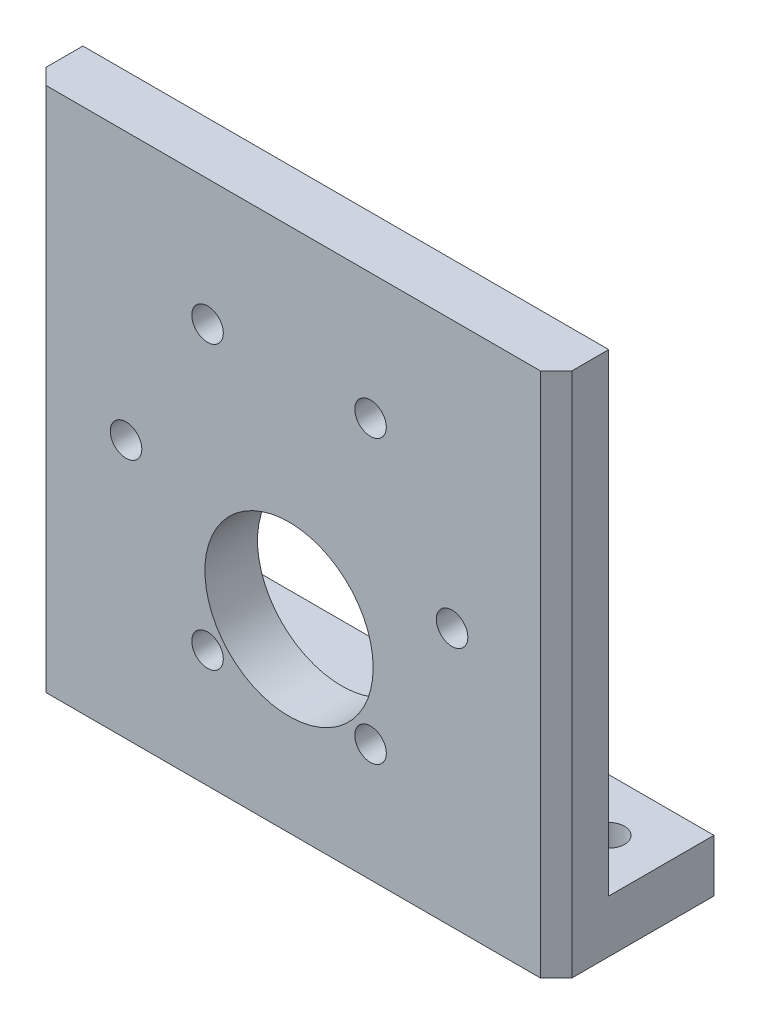
ISO-10303-21;
HEADER;
FILE_DESCRIPTION(('STEP AP214'),'2;1');
FILE_NAME('part.step','',(''),(''),'','','');
FILE_SCHEMA(('AUTOMOTIVE_DESIGN { 1 0 10303 214 1 1 1 1 }'));
ENDSEC;
DATA;
#1=APPLICATION_CONTEXT('core data for automotive mechanical design processes');
#2=APPLICATION_PROTOCOL_DEFINITION('international standard','automotive_design',2000,#1);
#3=PRODUCT_CONTEXT('',#1,'mechanical');
#4=PRODUCT('Part','Part','',(#3));
#5=PRODUCT_RELATED_PRODUCT_CATEGORY('part','',(#4));
#6=PRODUCT_DEFINITION_FORMATION('','',#4);
#7=PRODUCT_DEFINITION_CONTEXT('part definition',#1,'design');
#8=PRODUCT_DEFINITION('design','',#6,#7);
#9=PRODUCT_DEFINITION_SHAPE('','',#8);
#10=(LENGTH_UNIT() NAMED_UNIT(*) SI_UNIT(.MILLI.,.METRE.));
#11=(NAMED_UNIT(*) PLANE_ANGLE_UNIT() SI_UNIT($,.RADIAN.));
#12=(NAMED_UNIT(*) SI_UNIT($,.STERADIAN.) SOLID_ANGLE_UNIT());
#13=UNCERTAINTY_MEASURE_WITH_UNIT(LENGTH_MEASURE(1.E-05),#10,'distance_accuracy_value','');
#14=(GEOMETRIC_REPRESENTATION_CONTEXT(3) GLOBAL_UNCERTAINTY_ASSIGNED_CONTEXT((#13)) GLOBAL_UNIT_ASSIGNED_CONTEXT((#10,
#11,#12)) REPRESENTATION_CONTEXT('',''));
#15=CARTESIAN_POINT('',(0.,0.,0.));
#16=DIRECTION('',(0.,0.,1.));
#17=DIRECTION('',(1.,0.,0.));
#18=AXIS2_PLACEMENT_3D('',#15,#16,#17);
#19=CARTESIAN_POINT('',(0.,0.,5.));
#20=DIRECTION('',(0.,0.,-1.));
#21=DIRECTION('',(-1.,0.,0.));
#22=AXIS2_PLACEMENT_3D('',#19,#20,#21);
#23=PLANE('',#22);
#24=DIRECTION('',(1.,0.,0.));
#25=VECTOR('',#24,1.);
#26=CARTESIAN_POINT('',(-24.3882668097816,-24.2880457452489,5.));
#27=LINE('',#26,#25);
#28=CARTESIAN_POINT('',(-22.8882668097816,-24.2880457452489,5.));
#29=VERTEX_POINT('',#28);
#30=CARTESIAN_POINT('',(24.1117331902184,-24.2880457452489,5.));
#31=VERTEX_POINT('',#30);
#32=EDGE_CURVE('E119',#29,#31,#27,.T.);
#33=ORIENTED_EDGE('',*,*,#32,.T.);
#34=DIRECTION('',(0.,1.,0.));
#35=VECTOR('',#34,1.);
#36=CARTESIAN_POINT('',(24.1117331902184,0.,5.));
#37=LINE('',#36,#35);
#38=CARTESIAN_POINT('',(24.1117331902184,25.7119542547511,5.));
#39=VERTEX_POINT('',#38);
#40=EDGE_CURVE('E250',#31,#39,#37,.T.);
#41=ORIENTED_EDGE('',*,*,#40,.T.);
#42=DIRECTION('',(-1.,0.,0.));
#43=VECTOR('',#42,1.);
#44=CARTESIAN_POINT('',(-24.3882668097816,25.7119542547511,5.));
#45=LINE('',#44,#43);
#46=CARTESIAN_POINT('',(-22.8882668097816,25.7119542547511,5.));
#47=VERTEX_POINT('',#46);
#48=EDGE_CURVE('E212',#39,#47,#45,.T.);
#49=ORIENTED_EDGE('',*,*,#48,.T.);
#50=DIRECTION('',(0.,-1.,0.));
#51=VECTOR('',#50,1.);
#52=CARTESIAN_POINT('',(-22.8882668097816,0.,5.));
#53=LINE('',#52,#51);
#54=EDGE_CURVE('E238',#47,#29,#53,.T.);
#55=ORIENTED_EDGE('',*,*,#54,.T.);
#56=EDGE_LOOP('',(#33,#41,#49,#55));
#57=FACE_BOUND('',#56,.T.);
#58=CARTESIAN_POINT('',(-7.53826680978156,13.7353480134099,5.));
#59=DIRECTION('',(0.,0.,1.));
#60=DIRECTION('',(1.,0.,0.));
#61=AXIS2_PLACEMENT_3D('',#58,#59,#60);
#62=CIRCLE('',#61,1.5);
#63=CARTESIAN_POINT('',(-6.03826680978157,13.7353480134099,5.));
#64=VERTEX_POINT('',#63);
#65=EDGE_CURVE('E204',#64,#64,#62,.T.);
#66=ORIENTED_EDGE('',*,*,#65,.F.);
#67=EDGE_LOOP('',(#66));
#68=FACE_BOUND('',#67,.T.);
#69=CARTESIAN_POINT('',(7.96173319021844,13.7353480134099,5.));
#70=DIRECTION('',(0.,0.,1.));
#71=DIRECTION('',(1.,0.,0.));
#72=AXIS2_PLACEMENT_3D('',#69,#70,#71);
#73=CIRCLE('',#72,1.5);
#74=CARTESIAN_POINT('',(9.46173319021844,13.7353480134099,5.));
#75=VERTEX_POINT('',#74);
#76=EDGE_CURVE('E196',#75,#75,#73,.T.);
#77=ORIENTED_EDGE('',*,*,#76,.F.);
#78=EDGE_LOOP('',(#77));
#79=FACE_BOUND('',#78,.T.);
#80=CARTESIAN_POINT('',(-15.2882668097816,0.311954254751074,5.));
#81=DIRECTION('',(0.,0.,1.));
#82=DIRECTION('',(1.,0.,0.));
#83=AXIS2_PLACEMENT_3D('',#80,#81,#82);
#84=CIRCLE('',#83,1.5);
#85=CARTESIAN_POINT('',(-13.7882668097816,0.311954254751074,5.));
#86=VERTEX_POINT('',#85);
#87=EDGE_CURVE('E188',#86,#86,#84,.T.);
#88=ORIENTED_EDGE('',*,*,#87,.F.);
#89=EDGE_LOOP('',(#88));
#90=FACE_BOUND('',#89,.T.);
#91=CARTESIAN_POINT('',(-7.53826680978156,-13.1114395039077,5.));
#92=DIRECTION('',(0.,0.,1.));
#93=DIRECTION('',(1.,0.,0.));
#94=AXIS2_PLACEMENT_3D('',#91,#92,#93);
#95=CIRCLE('',#94,1.5);
#96=CARTESIAN_POINT('',(-6.03826680978156,-13.1114395039077,5.));
#97=VERTEX_POINT('',#96);
#98=EDGE_CURVE('E180',#97,#97,#95,.T.);
#99=ORIENTED_EDGE('',*,*,#98,.F.);
#100=EDGE_LOOP('',(#99));
#101=FACE_BOUND('',#100,.T.);
#102=CARTESIAN_POINT('',(7.96173319021844,-13.1114395039077,5.));
#103=DIRECTION('',(0.,0.,1.));
#104=DIRECTION('',(1.,0.,0.));
#105=AXIS2_PLACEMENT_3D('',#102,#103,#104);
#106=CIRCLE('',#105,1.5);
#107=CARTESIAN_POINT('',(9.46173319021844,-13.1114395039077,5.));
#108=VERTEX_POINT('',#107);
#109=EDGE_CURVE('E172',#108,#108,#106,.T.);
#110=ORIENTED_EDGE('',*,*,#109,.F.);
#111=EDGE_LOOP('',(#110));
#112=FACE_BOUND('',#111,.T.);
#113=CARTESIAN_POINT('',(15.7117331902184,0.311954254751071,5.));
#114=DIRECTION('',(0.,0.,1.));
#115=DIRECTION('',(1.,0.,0.));
#116=AXIS2_PLACEMENT_3D('',#113,#114,#115);
#117=CIRCLE('',#116,1.5);
#118=CARTESIAN_POINT('',(17.2117331902184,0.311954254751071,5.));
#119=VERTEX_POINT('',#118);
#120=EDGE_CURVE('E164',#119,#119,#117,.T.);
#121=ORIENTED_EDGE('',*,*,#120,.F.);
#122=EDGE_LOOP('',(#121));
#123=FACE_BOUND('',#122,.T.);
#124=CARTESIAN_POINT('',(0.211733190218437,-6.68804574524893,5.));
#125=DIRECTION('',(0.,0.,1.));
#126=DIRECTION('',(1.,0.,0.));
#127=AXIS2_PLACEMENT_3D('',#124,#125,#126);
#128=CIRCLE('',#127,8.00000000000001);
#129=CARTESIAN_POINT('',(8.21173319021844,-6.68804574524893,5.));
#130=VERTEX_POINT('',#129);
#131=EDGE_CURVE('E156',#130,#130,#128,.T.);
#132=ORIENTED_EDGE('',*,*,#131,.F.);
#133=EDGE_LOOP('',(#132));
#134=FACE_BOUND('',#133,.T.);
#135=ADVANCED_FACE('F45',(#57,#68,#79,#90,#101,#112,#123,#134),#23,.F.);
#136=CARTESIAN_POINT('',(0.,0.,0.));
#137=DIRECTION('',(0.,0.,-1.));
#138=DIRECTION('',(-1.,0.,0.));
#139=AXIS2_PLACEMENT_3D('',#136,#137,#138);
#140=PLANE('',#139);
#141=DIRECTION('',(1.,0.,0.));
#142=VECTOR('',#141,1.);
#143=CARTESIAN_POINT('',(25.6117331902184,-19.2880457452489,0.));
#144=LINE('',#143,#142);
#145=CARTESIAN_POINT('',(-24.3882668097816,-19.2880457452489,0.));
#146=VERTEX_POINT('',#145);
#147=CARTESIAN_POINT('',(25.6117331902184,-19.2880457452489,0.));
#148=VERTEX_POINT('',#147);
#149=EDGE_CURVE('E134',#146,#148,#144,.T.);
#150=ORIENTED_EDGE('',*,*,#149,.F.);
#151=DIRECTION('',(0.,-1.,0.));
#152=VECTOR('',#151,1.);
#153=CARTESIAN_POINT('',(-24.3882668097816,-24.2880457452489,0.));
#154=LINE('',#153,#152);
#155=CARTESIAN_POINT('',(-24.3882668097816,25.7119542547511,0.));
#156=VERTEX_POINT('',#155);
#157=EDGE_CURVE('E216',#156,#146,#154,.T.);
#158=ORIENTED_EDGE('',*,*,#157,.F.);
#159=DIRECTION('',(-1.,0.,0.));
#160=VECTOR('',#159,1.);
#161=CARTESIAN_POINT('',(-24.3882668097816,25.7119542547511,0.));
#162=LINE('',#161,#160);
#163=CARTESIAN_POINT('',(25.6117331902184,25.7119542547511,0.));
#164=VERTEX_POINT('',#163);
#165=EDGE_CURVE('E223',#164,#156,#162,.T.);
#166=ORIENTED_EDGE('',*,*,#165,.F.);
#167=DIRECTION('',(0.,1.,0.));
#168=VECTOR('',#167,1.);
#169=CARTESIAN_POINT('',(25.6117331902184,-24.2880457452489,0.));
#170=LINE('',#169,#168);
#171=EDGE_CURVE('E208',#148,#164,#170,.T.);
#172=ORIENTED_EDGE('',*,*,#171,.F.);
#173=EDGE_LOOP('',(#150,#158,#166,#172));
#174=FACE_BOUND('',#173,.T.);
#175=CARTESIAN_POINT('',(15.7117331902184,0.311954254751071,0.));
#176=DIRECTION('',(0.,0.,1.));
#177=DIRECTION('',(1.,0.,0.));
#178=AXIS2_PLACEMENT_3D('',#175,#176,#177);
#179=CIRCLE('',#178,1.5);
#180=CARTESIAN_POINT('',(17.2117331902184,0.311954254751071,0.));
#181=VERTEX_POINT('',#180);
#182=EDGE_CURVE('E160',#181,#181,#179,.T.);
#183=ORIENTED_EDGE('',*,*,#182,.T.);
#184=EDGE_LOOP('',(#183));
#185=FACE_BOUND('',#184,.T.);
#186=CARTESIAN_POINT('',(-7.53826680978156,-13.1114395039077,0.));
#187=DIRECTION('',(0.,0.,1.));
#188=DIRECTION('',(1.,0.,0.));
#189=AXIS2_PLACEMENT_3D('',#186,#187,#188);
#190=CIRCLE('',#189,1.5);
#191=CARTESIAN_POINT('',(-6.03826680978156,-13.1114395039077,0.));
#192=VERTEX_POINT('',#191);
#193=EDGE_CURVE('E176',#192,#192,#190,.T.);
#194=ORIENTED_EDGE('',*,*,#193,.T.);
#195=EDGE_LOOP('',(#194));
#196=FACE_BOUND('',#195,.T.);
#197=CARTESIAN_POINT('',(7.96173319021844,13.7353480134099,0.));
#198=DIRECTION('',(0.,0.,1.));
#199=DIRECTION('',(1.,0.,0.));
#200=AXIS2_PLACEMENT_3D('',#197,#198,#199);
#201=CIRCLE('',#200,1.5);
#202=CARTESIAN_POINT('',(9.46173319021844,13.7353480134099,0.));
#203=VERTEX_POINT('',#202);
#204=EDGE_CURVE('E192',#203,#203,#201,.T.);
#205=ORIENTED_EDGE('',*,*,#204,.T.);
#206=EDGE_LOOP('',(#205));
#207=FACE_BOUND('',#206,.T.);
#208=CARTESIAN_POINT('',(-7.53826680978156,13.7353480134099,0.));
#209=DIRECTION('',(0.,0.,1.));
#210=DIRECTION('',(1.,0.,0.));
#211=AXIS2_PLACEMENT_3D('',#208,#209,#210);
#212=CIRCLE('',#211,1.5);
#213=CARTESIAN_POINT('',(-6.03826680978157,13.7353480134099,0.));
#214=VERTEX_POINT('',#213);
#215=EDGE_CURVE('E200',#214,#214,#212,.T.);
#216=ORIENTED_EDGE('',*,*,#215,.T.);
#217=EDGE_LOOP('',(#216));
#218=FACE_BOUND('',#217,.T.);
#219=CARTESIAN_POINT('',(-15.2882668097816,0.311954254751074,0.));
#220=DIRECTION('',(0.,0.,1.));
#221=DIRECTION('',(1.,0.,0.));
#222=AXIS2_PLACEMENT_3D('',#219,#220,#221);
#223=CIRCLE('',#222,1.5);
#224=CARTESIAN_POINT('',(-13.7882668097816,0.311954254751074,0.));
#225=VERTEX_POINT('',#224);
#226=EDGE_CURVE('E184',#225,#225,#223,.T.);
#227=ORIENTED_EDGE('',*,*,#226,.T.);
#228=EDGE_LOOP('',(#227));
#229=FACE_BOUND('',#228,.T.);
#230=CARTESIAN_POINT('',(7.96173319021844,-13.1114395039077,0.));
#231=DIRECTION('',(0.,0.,1.));
#232=DIRECTION('',(1.,0.,0.));
#233=AXIS2_PLACEMENT_3D('',#230,#231,#232);
#234=CIRCLE('',#233,1.5);
#235=CARTESIAN_POINT('',(9.46173319021844,-13.1114395039077,0.));
#236=VERTEX_POINT('',#235);
#237=EDGE_CURVE('E168',#236,#236,#234,.T.);
#238=ORIENTED_EDGE('',*,*,#237,.T.);
#239=EDGE_LOOP('',(#238));
#240=FACE_BOUND('',#239,.T.);
#241=CARTESIAN_POINT('',(0.211733190218437,-6.68804574524893,0.));
#242=DIRECTION('',(0.,0.,1.));
#243=DIRECTION('',(1.,0.,0.));
#244=AXIS2_PLACEMENT_3D('',#241,#242,#243);
#245=CIRCLE('',#244,8.00000000000001);
#246=CARTESIAN_POINT('',(8.21173319021844,-6.68804574524893,0.));
#247=VERTEX_POINT('',#246);
#248=EDGE_CURVE('E155',#247,#247,#245,.T.);
#249=ORIENTED_EDGE('',*,*,#248,.T.);
#250=EDGE_LOOP('',(#249));
#251=FACE_BOUND('',#250,.T.);
#252=ADVANCED_FACE('F276',(#174,#185,#196,#207,#218,#229,#240,#251),#140,.T.);
#253=CARTESIAN_POINT('',(25.6117331902184,-24.2880457452489,5.));
#254=DIRECTION('',(-1.,0.,0.));
#255=DIRECTION('',(0.,0.,1.));
#256=AXIS2_PLACEMENT_3D('',#253,#254,#255);
#257=PLANE('',#256);
#258=DIRECTION('',(0.,0.,-1.));
#259=VECTOR('',#258,1.);
#260=CARTESIAN_POINT('',(25.6117331902184,25.7119542547511,5.));
#261=LINE('',#260,#259);
#262=CARTESIAN_POINT('',(25.6117331902184,25.7119542547511,3.50000000000001));
#263=VERTEX_POINT('',#262);
#264=EDGE_CURVE('E235',#263,#164,#261,.T.);
#265=ORIENTED_EDGE('',*,*,#264,.F.);
#266=DIRECTION('',(0.,-1.,0.));
#267=VECTOR('',#266,1.);
#268=CARTESIAN_POINT('',(25.6117331902184,-24.2880457452489,3.50000000000001));
#269=LINE('',#268,#267);
#270=CARTESIAN_POINT('',(25.6117331902184,-24.2880457452489,3.50000000000001));
#271=VERTEX_POINT('',#270);
#272=EDGE_CURVE('E70',#263,#271,#269,.T.);
#273=ORIENTED_EDGE('',*,*,#272,.T.);
#274=DIRECTION('',(0.,0.,-1.));
#275=VECTOR('',#274,1.);
#276=CARTESIAN_POINT('',(25.6117331902184,-24.2880457452489,5.));
#277=LINE('',#276,#275);
#278=CARTESIAN_POINT('',(25.6117331902184,-24.2880457452489,-10.));
#279=VERTEX_POINT('',#278);
#280=EDGE_CURVE('E110',#271,#279,#277,.T.);
#281=ORIENTED_EDGE('',*,*,#280,.T.);
#282=DIRECTION('',(0.,-1.,0.));
#283=VECTOR('',#282,1.);
#284=CARTESIAN_POINT('',(25.6117331902184,-24.2880457452489,-10.));
#285=LINE('',#284,#283);
#286=CARTESIAN_POINT('',(25.6117331902184,-19.2880457452489,-10.));
#287=VERTEX_POINT('',#286);
#288=EDGE_CURVE('E115',#287,#279,#285,.T.);
#289=ORIENTED_EDGE('',*,*,#288,.F.);
#290=DIRECTION('',(0.,0.,1.));
#291=VECTOR('',#290,1.);
#292=CARTESIAN_POINT('',(25.6117331902184,-19.2880457452489,-10.));
#293=LINE('',#292,#291);
#294=EDGE_CURVE('E147',#287,#148,#293,.T.);
#295=ORIENTED_EDGE('',*,*,#294,.T.);
#296=ORIENTED_EDGE('',*,*,#171,.T.);
#297=EDGE_LOOP('',(#265,#273,#281,#289,#295,#296));
#298=FACE_BOUND('',#297,.T.);
#299=ADVANCED_FACE('F112',(#298),#257,.F.);
#300=CARTESIAN_POINT('',(-24.3882668097816,25.7119542547511,5.));
#301=DIRECTION('',(0.,-1.,0.));
#302=DIRECTION('',(0.,0.,-1.));
#303=AXIS2_PLACEMENT_3D('',#300,#301,#302);
#304=PLANE('',#303);
#305=ORIENTED_EDGE('',*,*,#48,.F.);
#306=DIRECTION('',(-0.707106781186546,0.,0.707106781186549));
#307=VECTOR('',#306,1.);
#308=CARTESIAN_POINT('',(24.1117331902184,25.7119542547511,5.));
#309=LINE('',#308,#307);
#310=EDGE_CURVE('E257',#39,#263,#309,.F.);
#311=ORIENTED_EDGE('',*,*,#310,.T.);
#312=ORIENTED_EDGE('',*,*,#264,.T.);
#313=ORIENTED_EDGE('',*,*,#165,.T.);
#314=DIRECTION('',(0.,0.,-1.));
#315=VECTOR('',#314,1.);
#316=CARTESIAN_POINT('',(-24.3882668097816,25.7119542547511,5.));
#317=LINE('',#316,#315);
#318=CARTESIAN_POINT('',(-24.3882668097816,25.7119542547511,3.50000000000001));
#319=VERTEX_POINT('',#318);
#320=EDGE_CURVE('E232',#319,#156,#317,.T.);
#321=ORIENTED_EDGE('',*,*,#320,.F.);
#322=DIRECTION('',(-0.707106781186546,0.,-0.707106781186549));
#323=VECTOR('',#322,1.);
#324=CARTESIAN_POINT('',(-22.8882668097816,25.7119542547511,5.));
#325=LINE('',#324,#323);
#326=EDGE_CURVE('E254',#319,#47,#325,.F.);
#327=ORIENTED_EDGE('',*,*,#326,.T.);
#328=EDGE_LOOP('',(#305,#311,#312,#313,#321,#327));
#329=FACE_BOUND('',#328,.T.);
#330=ADVANCED_FACE('F272',(#329),#304,.F.);
#331=CARTESIAN_POINT('',(-24.3882668097816,-24.2880457452489,5.));
#332=DIRECTION('',(1.,0.,0.));
#333=DIRECTION('',(0.,0.,-1.));
#334=AXIS2_PLACEMENT_3D('',#331,#332,#333);
#335=PLANE('',#334);
#336=DIRECTION('',(0.,0.,-1.));
#337=VECTOR('',#336,1.);
#338=CARTESIAN_POINT('',(-24.3882668097816,-24.2880457452489,5.));
#339=LINE('',#338,#337);
#340=CARTESIAN_POINT('',(-24.3882668097816,-24.2880457452489,3.50000000000001));
#341=VERTEX_POINT('',#340);
#342=CARTESIAN_POINT('',(-24.3882668097816,-24.2880457452489,-10.));
#343=VERTEX_POINT('',#342);
#344=EDGE_CURVE('E118',#341,#343,#339,.T.);
#345=ORIENTED_EDGE('',*,*,#344,.F.);
#346=DIRECTION('',(0.,1.,0.));
#347=VECTOR('',#346,1.);
#348=CARTESIAN_POINT('',(-24.3882668097816,-24.2880457452489,3.50000000000001));
#349=LINE('',#348,#347);
#350=EDGE_CURVE('E11',#341,#319,#349,.T.);
#351=ORIENTED_EDGE('',*,*,#350,.T.);
#352=ORIENTED_EDGE('',*,*,#320,.T.);
#353=ORIENTED_EDGE('',*,*,#157,.T.);
#354=DIRECTION('',(0.,0.,1.));
#355=VECTOR('',#354,1.);
#356=CARTESIAN_POINT('',(-24.3882668097816,-19.2880457452489,-10.));
#357=LINE('',#356,#355);
#358=CARTESIAN_POINT('',(-24.3882668097816,-19.2880457452489,-10.));
#359=VERTEX_POINT('',#358);
#360=EDGE_CURVE('E151',#359,#146,#357,.T.);
#361=ORIENTED_EDGE('',*,*,#360,.F.);
#362=DIRECTION('',(0.,1.,0.));
#363=VECTOR('',#362,1.);
#364=CARTESIAN_POINT('',(-24.3882668097816,-24.2880457452489,-10.));
#365=LINE('',#364,#363);
#366=EDGE_CURVE('E127',#343,#359,#365,.T.);
#367=ORIENTED_EDGE('',*,*,#366,.F.);
#368=EDGE_LOOP('',(#345,#351,#352,#353,#361,#367));
#369=FACE_BOUND('',#368,.T.);
#370=ADVANCED_FACE('F283',(#369),#335,.F.);
#371=CARTESIAN_POINT('',(-24.3882668097816,-24.2880457452489,5.));
#372=DIRECTION('',(0.,1.,0.));
#373=DIRECTION('',(0.,0.,1.));
#374=AXIS2_PLACEMENT_3D('',#371,#372,#373);
#375=PLANE('',#374);
#376=CARTESIAN_POINT('',(-19.3882668097816,-24.2880457452489,-5.));
#377=DIRECTION('',(0.,-1.,0.));
#378=DIRECTION('',(0.,0.,-1.));
#379=AXIS2_PLACEMENT_3D('',#376,#377,#378);
#380=CIRCLE('',#379,1.5);
#381=CARTESIAN_POINT('',(-19.3882668097816,-24.2880457452489,-6.5));
#382=VERTEX_POINT('',#381);
#383=EDGE_CURVE('E243',#382,#382,#380,.T.);
#384=ORIENTED_EDGE('',*,*,#383,.F.);
#385=EDGE_LOOP('',(#384));
#386=FACE_BOUND('',#385,.T.);
#387=CARTESIAN_POINT('',(20.6117331902184,-24.2880457452489,-4.99999999999999));
#388=DIRECTION('',(0.,-1.,0.));
#389=DIRECTION('',(0.,0.,-1.));
#390=AXIS2_PLACEMENT_3D('',#387,#388,#389);
#391=CIRCLE('',#390,1.5);
#392=CARTESIAN_POINT('',(20.6117331902184,-24.2880457452489,-6.49999999999999));
#393=VERTEX_POINT('',#392);
#394=EDGE_CURVE('E141',#393,#393,#391,.T.);
#395=ORIENTED_EDGE('',*,*,#394,.F.);
#396=EDGE_LOOP('',(#395));
#397=FACE_BOUND('',#396,.T.);
#398=ORIENTED_EDGE('',*,*,#280,.F.);
#399=DIRECTION('',(0.707106781186546,0.,-0.707106781186549));
#400=VECTOR('',#399,1.);
#401=CARTESIAN_POINT('',(24.1117331902184,-24.2880457452489,5.));
#402=LINE('',#401,#400);
#403=EDGE_CURVE('E55',#271,#31,#402,.F.);
#404=ORIENTED_EDGE('',*,*,#403,.T.);
#405=ORIENTED_EDGE('',*,*,#32,.F.);
#406=DIRECTION('',(0.707106781186546,0.,0.707106781186549));
#407=VECTOR('',#406,1.);
#408=CARTESIAN_POINT('',(-22.8882668097816,-24.2880457452489,5.));
#409=LINE('',#408,#407);
#410=EDGE_CURVE('E62',#29,#341,#409,.F.);
#411=ORIENTED_EDGE('',*,*,#410,.T.);
#412=ORIENTED_EDGE('',*,*,#344,.T.);
#413=DIRECTION('',(-1.,0.,0.));
#414=VECTOR('',#413,1.);
#415=CARTESIAN_POINT('',(25.6117331902184,-24.2880457452489,-10.));
#416=LINE('',#415,#414);
#417=EDGE_CURVE('E122',#279,#343,#416,.T.);
#418=ORIENTED_EDGE('',*,*,#417,.F.);
#419=EDGE_LOOP('',(#398,#404,#405,#411,#412,#418));
#420=FACE_BOUND('',#419,.T.);
#421=ADVANCED_FACE('F123',(#386,#397,#420),#375,.F.);
#422=CARTESIAN_POINT('',(-7.53826680978156,13.7353480134099,5.));
#423=DIRECTION('',(0.,0.,-1.));
#424=DIRECTION('',(-1.,0.,0.));
#425=AXIS2_PLACEMENT_3D('',#422,#423,#424);
#426=CYLINDRICAL_SURFACE('',#425,1.5);
#427=ORIENTED_EDGE('',*,*,#65,.T.);
#428=EDGE_LOOP('',(#427));
#429=FACE_BOUND('',#428,.T.);
#430=ORIENTED_EDGE('',*,*,#215,.F.);
#431=EDGE_LOOP('',(#430));
#432=FACE_BOUND('',#431,.T.);
#433=ADVANCED_FACE('F308',(#429,#432),#426,.F.);
#434=CARTESIAN_POINT('',(7.96173319021844,13.7353480134099,5.));
#435=DIRECTION('',(0.,0.,-1.));
#436=DIRECTION('',(-1.,0.,0.));
#437=AXIS2_PLACEMENT_3D('',#434,#435,#436);
#438=CYLINDRICAL_SURFACE('',#437,1.5);
#439=ORIENTED_EDGE('',*,*,#76,.T.);
#440=EDGE_LOOP('',(#439));
#441=FACE_BOUND('',#440,.T.);
#442=ORIENTED_EDGE('',*,*,#204,.F.);
#443=EDGE_LOOP('',(#442));
#444=FACE_BOUND('',#443,.T.);
#445=ADVANCED_FACE('F443',(#441,#444),#438,.F.);
#446=CARTESIAN_POINT('',(-15.2882668097816,0.311954254751074,5.));
#447=DIRECTION('',(0.,0.,-1.));
#448=DIRECTION('',(-1.,0.,0.));
#449=AXIS2_PLACEMENT_3D('',#446,#447,#448);
#450=CYLINDRICAL_SURFACE('',#449,1.5);
#451=ORIENTED_EDGE('',*,*,#87,.T.);
#452=EDGE_LOOP('',(#451));
#453=FACE_BOUND('',#452,.T.);
#454=ORIENTED_EDGE('',*,*,#226,.F.);
#455=EDGE_LOOP('',(#454));
#456=FACE_BOUND('',#455,.T.);
#457=ADVANCED_FACE('F432',(#453,#456),#450,.F.);
#458=CARTESIAN_POINT('',(-7.53826680978156,-13.1114395039077,5.));
#459=DIRECTION('',(0.,0.,-1.));
#460=DIRECTION('',(-1.,0.,0.));
#461=AXIS2_PLACEMENT_3D('',#458,#459,#460);
#462=CYLINDRICAL_SURFACE('',#461,1.5);
#463=ORIENTED_EDGE('',*,*,#98,.T.);
#464=EDGE_LOOP('',(#463));
#465=FACE_BOUND('',#464,.T.);
#466=ORIENTED_EDGE('',*,*,#193,.F.);
#467=EDGE_LOOP('',(#466));
#468=FACE_BOUND('',#467,.T.);
#469=ADVANCED_FACE('F421',(#465,#468),#462,.F.);
#470=CARTESIAN_POINT('',(7.96173319021844,-13.1114395039077,5.));
#471=DIRECTION('',(0.,0.,-1.));
#472=DIRECTION('',(-1.,0.,0.));
#473=AXIS2_PLACEMENT_3D('',#470,#471,#472);
#474=CYLINDRICAL_SURFACE('',#473,1.5);
#475=ORIENTED_EDGE('',*,*,#109,.T.);
#476=EDGE_LOOP('',(#475));
#477=FACE_BOUND('',#476,.T.);
#478=ORIENTED_EDGE('',*,*,#237,.F.);
#479=EDGE_LOOP('',(#478));
#480=FACE_BOUND('',#479,.T.);
#481=ADVANCED_FACE('F410',(#477,#480),#474,.F.);
#482=CARTESIAN_POINT('',(15.7117331902184,0.311954254751071,5.));
#483=DIRECTION('',(0.,0.,-1.));
#484=DIRECTION('',(-1.,0.,0.));
#485=AXIS2_PLACEMENT_3D('',#482,#483,#484);
#486=CYLINDRICAL_SURFACE('',#485,1.5);
#487=ORIENTED_EDGE('',*,*,#120,.T.);
#488=EDGE_LOOP('',(#487));
#489=FACE_BOUND('',#488,.T.);
#490=ORIENTED_EDGE('',*,*,#182,.F.);
#491=EDGE_LOOP('',(#490));
#492=FACE_BOUND('',#491,.T.);
#493=ADVANCED_FACE('F297',(#489,#492),#486,.F.);
#494=CARTESIAN_POINT('',(0.211733190218437,-6.68804574524893,5.));
#495=DIRECTION('',(0.,0.,-1.));
#496=DIRECTION('',(-1.,0.,0.));
#497=AXIS2_PLACEMENT_3D('',#494,#495,#496);
#498=CYLINDRICAL_SURFACE('',#497,8.00000000000001);
#499=ORIENTED_EDGE('',*,*,#131,.T.);
#500=EDGE_LOOP('',(#499));
#501=FACE_BOUND('',#500,.T.);
#502=ORIENTED_EDGE('',*,*,#248,.F.);
#503=EDGE_LOOP('',(#502));
#504=FACE_BOUND('',#503,.T.);
#505=ADVANCED_FACE('F288',(#501,#504),#498,.F.);
#506=CARTESIAN_POINT('',(25.6117331902184,-19.2880457452489,-10.));
#507=DIRECTION('',(0.,-1.,0.));
#508=DIRECTION('',(1.,0.,0.));
#509=AXIS2_PLACEMENT_3D('',#506,#507,#508);
#510=PLANE('',#509);
#511=CARTESIAN_POINT('',(-19.3882668097816,-19.2880457452489,-5.));
#512=DIRECTION('',(0.,-1.,0.));
#513=DIRECTION('',(1.,0.,0.));
#514=AXIS2_PLACEMENT_3D('',#511,#512,#513);
#515=CIRCLE('',#514,1.5);
#516=CARTESIAN_POINT('',(-17.8882668097816,-19.2880457452489,-5.));
#517=VERTEX_POINT('',#516);
#518=EDGE_CURVE('E138',#517,#517,#515,.T.);
#519=ORIENTED_EDGE('',*,*,#518,.T.);
#520=EDGE_LOOP('',(#519));
#521=FACE_BOUND('',#520,.T.);
#522=CARTESIAN_POINT('',(20.6117331902184,-19.2880457452489,-4.99999999999999));
#523=DIRECTION('',(0.,-1.,0.));
#524=DIRECTION('',(1.,0.,0.));
#525=AXIS2_PLACEMENT_3D('',#522,#523,#524);
#526=CIRCLE('',#525,1.5);
#527=CARTESIAN_POINT('',(22.1117331902184,-19.2880457452489,-4.99999999999999));
#528=VERTEX_POINT('',#527);
#529=EDGE_CURVE('E239',#528,#528,#526,.T.);
#530=ORIENTED_EDGE('',*,*,#529,.T.);
#531=EDGE_LOOP('',(#530));
#532=FACE_BOUND('',#531,.T.);
#533=ORIENTED_EDGE('',*,*,#149,.T.);
#534=ORIENTED_EDGE('',*,*,#294,.F.);
#535=DIRECTION('',(1.,0.,0.));
#536=VECTOR('',#535,1.);
#537=CARTESIAN_POINT('',(25.6117331902184,-19.2880457452489,-10.));
#538=LINE('',#537,#536);
#539=EDGE_CURVE('E131',#359,#287,#538,.T.);
#540=ORIENTED_EDGE('',*,*,#539,.F.);
#541=ORIENTED_EDGE('',*,*,#360,.T.);
#542=EDGE_LOOP('',(#533,#534,#540,#541));
#543=FACE_BOUND('',#542,.T.);
#544=ADVANCED_FACE('F286',(#521,#532,#543),#510,.F.);
#545=CARTESIAN_POINT('',(0.,0.,-10.));
#546=DIRECTION('',(0.,0.,1.));
#547=DIRECTION('',(1.,0.,0.));
#548=AXIS2_PLACEMENT_3D('',#545,#546,#547);
#549=PLANE('',#548);
#550=ORIENTED_EDGE('',*,*,#288,.T.);
#551=ORIENTED_EDGE('',*,*,#417,.T.);
#552=ORIENTED_EDGE('',*,*,#366,.T.);
#553=ORIENTED_EDGE('',*,*,#539,.T.);
#554=EDGE_LOOP('',(#550,#551,#552,#553));
#555=FACE_BOUND('',#554,.T.);
#556=ADVANCED_FACE('F129',(#555),#549,.F.);
#557=CARTESIAN_POINT('',(20.6117331902184,-14.2880457452489,-4.99999999999999));
#558=DIRECTION('',(0.,-1.,0.));
#559=DIRECTION('',(0.,0.,-1.));
#560=AXIS2_PLACEMENT_3D('',#557,#558,#559);
#561=CYLINDRICAL_SURFACE('',#560,1.5);
#562=ORIENTED_EDGE('',*,*,#394,.T.);
#563=EDGE_LOOP('',(#562));
#564=FACE_BOUND('',#563,.T.);
#565=ORIENTED_EDGE('',*,*,#529,.F.);
#566=EDGE_LOOP('',(#565));
#567=FACE_BOUND('',#566,.T.);
#568=ADVANCED_FACE('F295',(#564,#567),#561,.F.);
#569=CARTESIAN_POINT('',(-19.3882668097816,-14.2880457452489,-5.));
#570=DIRECTION('',(0.,-1.,0.));
#571=DIRECTION('',(0.,0.,-1.));
#572=AXIS2_PLACEMENT_3D('',#569,#570,#571);
#573=CYLINDRICAL_SURFACE('',#572,1.5);
#574=ORIENTED_EDGE('',*,*,#383,.T.);
#575=EDGE_LOOP('',(#574));
#576=FACE_BOUND('',#575,.T.);
#577=ORIENTED_EDGE('',*,*,#518,.F.);
#578=EDGE_LOOP('',(#577));
#579=FACE_BOUND('',#578,.T.);
#580=ADVANCED_FACE('F323',(#576,#579),#573,.F.);
#581=CARTESIAN_POINT('',(24.1117331902184,0.,5.));
#582=DIRECTION('',(-0.707106781186549,0.,-0.707106781186546));
#583=DIRECTION('',(0.,1.,0.));
#584=AXIS2_PLACEMENT_3D('',#581,#582,#583);
#585=PLANE('',#584);
#586=ORIENTED_EDGE('',*,*,#403,.F.);
#587=ORIENTED_EDGE('',*,*,#272,.F.);
#588=ORIENTED_EDGE('',*,*,#310,.F.);
#589=ORIENTED_EDGE('',*,*,#40,.F.);
#590=EDGE_LOOP('',(#586,#587,#588,#589));
#591=FACE_BOUND('',#590,.T.);
#592=ADVANCED_FACE('F270',(#591),#585,.F.);
#593=CARTESIAN_POINT('',(-22.8882668097816,0.,5.));
#594=DIRECTION('',(0.707106781186549,0.,-0.707106781186546));
#595=DIRECTION('',(0.,-1.,0.));
#596=AXIS2_PLACEMENT_3D('',#593,#594,#595);
#597=PLANE('',#596);
#598=ORIENTED_EDGE('',*,*,#326,.F.);
#599=ORIENTED_EDGE('',*,*,#350,.F.);
#600=ORIENTED_EDGE('',*,*,#410,.F.);
#601=ORIENTED_EDGE('',*,*,#54,.F.);
#602=EDGE_LOOP('',(#598,#599,#600,#601));
#603=FACE_BOUND('',#602,.T.);
#604=ADVANCED_FACE('F48',(#603),#597,.F.);
#605=CLOSED_SHELL('',(#135,#252,#299,#330,#370,#421,#433,#445,#457,#469,#481,#493,#505,#544,
#556,#568,#580,#592,#604));
#606=MANIFOLD_SOLID_BREP('B2',#605);
#607=ADVANCED_BREP_SHAPE_REPRESENTATION('',(#18,#606),#14);
#608=SHAPE_DEFINITION_REPRESENTATION(#9,#607);
ENDSEC;
END-ISO-10303-21;
